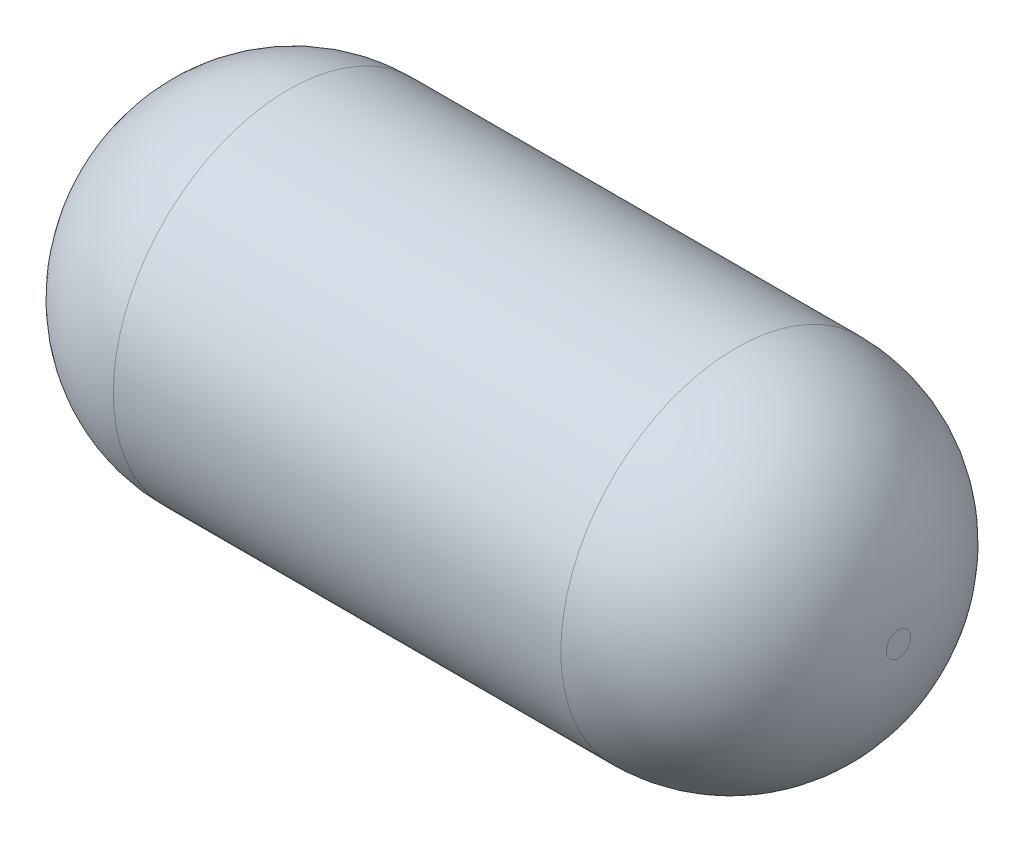
ISO-10303-21;
HEADER;
FILE_DESCRIPTION(('STEP AP214'),'2;1');
FILE_NAME('part.step','',(''),(''),'','','');
FILE_SCHEMA(('AUTOMOTIVE_DESIGN { 1 0 10303 214 1 1 1 1 }'));
ENDSEC;
DATA;
#1=APPLICATION_CONTEXT('core data for automotive mechanical design processes');
#2=APPLICATION_PROTOCOL_DEFINITION('international standard','automotive_design',2000,#1);
#3=PRODUCT_CONTEXT('',#1,'mechanical');
#4=PRODUCT('Part','Part','',(#3));
#5=PRODUCT_RELATED_PRODUCT_CATEGORY('part','',(#4));
#6=PRODUCT_DEFINITION_FORMATION('','',#4);
#7=PRODUCT_DEFINITION_CONTEXT('part definition',#1,'design');
#8=PRODUCT_DEFINITION('design','',#6,#7);
#9=PRODUCT_DEFINITION_SHAPE('','',#8);
#10=(LENGTH_UNIT() NAMED_UNIT(*) SI_UNIT(.MILLI.,.METRE.));
#11=(NAMED_UNIT(*) PLANE_ANGLE_UNIT() SI_UNIT($,.RADIAN.));
#12=(NAMED_UNIT(*) SI_UNIT($,.STERADIAN.) SOLID_ANGLE_UNIT());
#13=UNCERTAINTY_MEASURE_WITH_UNIT(LENGTH_MEASURE(1.E-05),#10,'distance_accuracy_value','');
#14=(GEOMETRIC_REPRESENTATION_CONTEXT(3) GLOBAL_UNCERTAINTY_ASSIGNED_CONTEXT((#13)) GLOBAL_UNIT_ASSIGNED_CONTEXT((#10,
#11,#12)) REPRESENTATION_CONTEXT('',''));
#15=CARTESIAN_POINT('',(0.,0.,0.));
#16=DIRECTION('',(0.,0.,1.));
#17=DIRECTION('',(1.,0.,0.));
#18=AXIS2_PLACEMENT_3D('',#15,#16,#17);
#19=CARTESIAN_POINT('',(-75.6143814941711,0.,0.));
#20=DIRECTION('',(1.,0.,0.));
#21=DIRECTION('',(0.,0.,-1.));
#22=AXIS2_PLACEMENT_3D('',#19,#20,#21);
#23=PLANE('',#22);
#24=CARTESIAN_POINT('',(-75.6143814941711,0.,0.));
#25=DIRECTION('',(-1.,0.,0.));
#26=DIRECTION('',(0.,0.,1.));
#27=AXIS2_PLACEMENT_3D('',#24,#25,#26);
#28=CIRCLE('',#27,3.80999999999964);
#29=CARTESIAN_POINT('',(-75.6143814941711,0.,3.80999999999964));
#30=VERTEX_POINT('',#29);
#31=EDGE_CURVE('E44',#30,#30,#28,.T.);
#32=ORIENTED_EDGE('',*,*,#31,.T.);
#33=EDGE_LOOP('',(#32));
#34=FACE_BOUND('',#33,.T.);
#35=ADVANCED_FACE('F30',(#34),#23,.F.);
#36=CARTESIAN_POINT('',(165.685618505829,0.,0.));
#37=DIRECTION('',(-1.,0.,0.));
#38=DIRECTION('',(0.,0.,1.));
#39=AXIS2_PLACEMENT_3D('',#36,#37,#38);
#40=PLANE('',#39);
#41=CARTESIAN_POINT('',(165.685618505829,0.,0.));
#42=DIRECTION('',(-1.,0.,0.));
#43=DIRECTION('',(0.,0.,1.));
#44=AXIS2_PLACEMENT_3D('',#41,#42,#43);
#45=CIRCLE('',#44,3.80999999999999);
#46=CARTESIAN_POINT('',(165.685618505829,0.,3.80999999999999));
#47=VERTEX_POINT('',#46);
#48=EDGE_CURVE('E10',#47,#47,#45,.T.);
#49=ORIENTED_EDGE('',*,*,#48,.F.);
#50=EDGE_LOOP('',(#49));
#51=FACE_BOUND('',#50,.T.);
#52=ADVANCED_FACE('F64',(#51),#40,.F.);
#53=CARTESIAN_POINT('',(114.885618505829,0.,0.));
#54=DIRECTION('',(-1.,0.,0.));
#55=DIRECTION('',(0.,0.,1.));
#56=AXIS2_PLACEMENT_3D('',#53,#54,#55);
#57=DEGENERATE_TOROIDAL_SURFACE('',#56,3.80999999999999,50.8,.T.);
#58=CARTESIAN_POINT('',(114.885618505829,0.,0.));
#59=DIRECTION('',(-1.,0.,0.));
#60=DIRECTION('',(0.,0.,1.));
#61=AXIS2_PLACEMENT_3D('',#58,#59,#60);
#62=CIRCLE('',#61,54.61);
#63=CARTESIAN_POINT('',(114.885618505829,0.,54.61));
#64=VERTEX_POINT('',#63);
#65=EDGE_CURVE('E36',#64,#64,#62,.T.);
#66=ORIENTED_EDGE('',*,*,#65,.F.);
#67=EDGE_LOOP('',(#66));
#68=FACE_BOUND('',#67,.T.);
#69=ORIENTED_EDGE('',*,*,#48,.T.);
#70=EDGE_LOOP('',(#69));
#71=FACE_BOUND('',#70,.T.);
#72=ADVANCED_FACE('F59',(#68,#71),#57,.T.);
#73=CARTESIAN_POINT('',(-75.6143814941711,0.,0.));
#74=DIRECTION('',(-1.,0.,0.));
#75=DIRECTION('',(0.,0.,1.));
#76=AXIS2_PLACEMENT_3D('',#73,#74,#75);
#77=CYLINDRICAL_SURFACE('',#76,54.61);
#78=CARTESIAN_POINT('',(-24.8143814941711,0.,0.));
#79=DIRECTION('',(-1.,0.,0.));
#80=DIRECTION('',(0.,0.,1.));
#81=AXIS2_PLACEMENT_3D('',#78,#79,#80);
#82=CIRCLE('',#81,54.61);
#83=CARTESIAN_POINT('',(-24.8143814941711,0.,54.61));
#84=VERTEX_POINT('',#83);
#85=EDGE_CURVE('E40',#84,#84,#82,.T.);
#86=ORIENTED_EDGE('',*,*,#85,.F.);
#87=EDGE_LOOP('',(#86));
#88=FACE_BOUND('',#87,.T.);
#89=ORIENTED_EDGE('',*,*,#65,.T.);
#90=EDGE_LOOP('',(#89));
#91=FACE_BOUND('',#90,.T.);
#92=ADVANCED_FACE('F54',(#88,#91),#77,.T.);
#93=CARTESIAN_POINT('',(-24.8143814941711,0.,0.));
#94=DIRECTION('',(-1.,0.,0.));
#95=DIRECTION('',(0.,0.,1.));
#96=AXIS2_PLACEMENT_3D('',#93,#94,#95);
#97=DEGENERATE_TOROIDAL_SURFACE('',#96,3.80999999999999,50.8,.T.);
#98=ORIENTED_EDGE('',*,*,#31,.F.);
#99=EDGE_LOOP('',(#98));
#100=FACE_BOUND('',#99,.T.);
#101=ORIENTED_EDGE('',*,*,#85,.T.);
#102=EDGE_LOOP('',(#101));
#103=FACE_BOUND('',#102,.T.);
#104=ADVANCED_FACE('F51',(#100,#103),#97,.T.);
#105=CLOSED_SHELL('',(#35,#52,#72,#92,#104));
#106=MANIFOLD_SOLID_BREP('B2',#105);
#107=ADVANCED_BREP_SHAPE_REPRESENTATION('',(#18,#106),#14);
#108=SHAPE_DEFINITION_REPRESENTATION(#9,#107);
ENDSEC;
END-ISO-10303-21;
